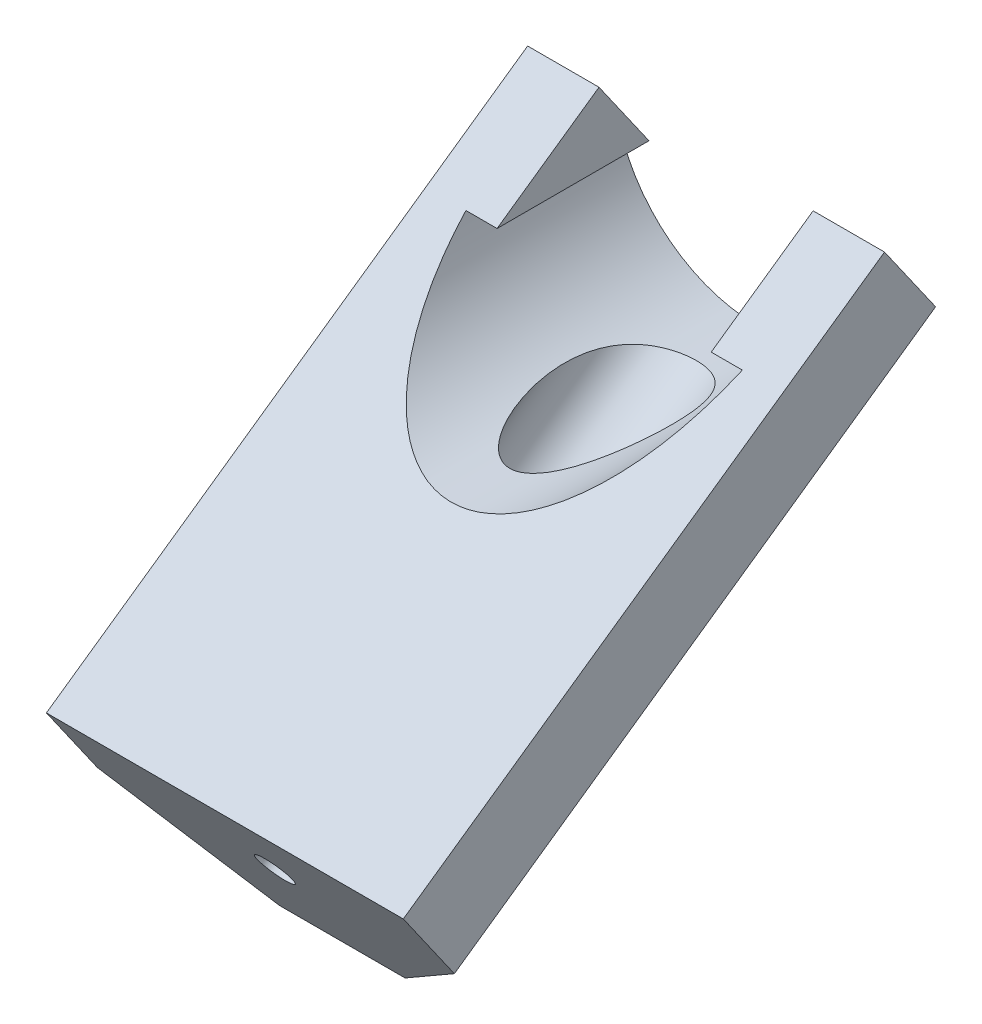
ISO-10303-21;
HEADER;
FILE_DESCRIPTION(('STEP AP214'),'2;1');
FILE_NAME('part.step','',(''),(''),'','','');
FILE_SCHEMA(('AUTOMOTIVE_DESIGN { 1 0 10303 214 1 1 1 1 }'));
ENDSEC;
DATA;
#1=APPLICATION_CONTEXT('core data for automotive mechanical design processes');
#2=APPLICATION_PROTOCOL_DEFINITION('international standard','automotive_design',2000,#1);
#3=PRODUCT_CONTEXT('',#1,'mechanical');
#4=PRODUCT('Part','Part','',(#3));
#5=PRODUCT_RELATED_PRODUCT_CATEGORY('part','',(#4));
#6=PRODUCT_DEFINITION_FORMATION('','',#4);
#7=PRODUCT_DEFINITION_CONTEXT('part definition',#1,'design');
#8=PRODUCT_DEFINITION('design','',#6,#7);
#9=PRODUCT_DEFINITION_SHAPE('','',#8);
#10=(LENGTH_UNIT() NAMED_UNIT(*) SI_UNIT(.MILLI.,.METRE.));
#11=(NAMED_UNIT(*) PLANE_ANGLE_UNIT() SI_UNIT($,.RADIAN.));
#12=(NAMED_UNIT(*) SI_UNIT($,.STERADIAN.) SOLID_ANGLE_UNIT());
#13=UNCERTAINTY_MEASURE_WITH_UNIT(LENGTH_MEASURE(1.E-05),#10,'distance_accuracy_value','');
#14=(GEOMETRIC_REPRESENTATION_CONTEXT(3) GLOBAL_UNCERTAINTY_ASSIGNED_CONTEXT((#13)) GLOBAL_UNIT_ASSIGNED_CONTEXT((#10,
#11,#12)) REPRESENTATION_CONTEXT('',''));
#15=CARTESIAN_POINT('',(0.,0.,0.));
#16=DIRECTION('',(0.,0.,1.));
#17=DIRECTION('',(1.,0.,0.));
#18=AXIS2_PLACEMENT_3D('',#15,#16,#17);
#19=CARTESIAN_POINT('',(0.,-59.9360282898142,78.6102637160665));
#20=DIRECTION('',(0.,0.573576436351043,-0.819152044288994));
#21=DIRECTION('',(0.,0.819152044288994,0.573576436351043));
#22=AXIS2_PLACEMENT_3D('',#19,#20,#21);
#23=CYLINDRICAL_SURFACE('',#22,2.5);
#24=CARTESIAN_POINT('',(0.,-52.2072930905312,67.5724859465728));
#25=DIRECTION('',(0.,-0.573576436351044,0.819152044288993));
#26=DIRECTION('',(0.,-0.819152044288993,-0.573576436351044));
#27=AXIS2_PLACEMENT_3D('',#24,#25,#26);
#28=CIRCLE('',#27,2.5);
#29=CARTESIAN_POINT('',(0.,-54.2551732012537,66.1385448556952));
#30=VERTEX_POINT('',#29);
#31=EDGE_CURVE('E154',#30,#30,#28,.T.);
#32=ORIENTED_EDGE('',*,*,#31,.T.);
#33=EDGE_LOOP('',(#32));
#34=FACE_BOUND('',#33,.T.);
#35=CARTESIAN_POINT('',(0.,-27.9430574540417,32.9195661871991));
#36=DIRECTION('',(0.,0.573576436351043,-0.819152044288994));
#37=DIRECTION('',(0.,0.819152044288994,0.573576436351043));
#38=AXIS2_PLACEMENT_3D('',#35,#36,#37);
#39=CIRCLE('',#38,2.5);
#40=CARTESIAN_POINT('',(0.,-25.8951773433193,34.3535072780767));
#41=VERTEX_POINT('',#40);
#42=EDGE_CURVE('E239',#41,#41,#39,.F.);
#43=ORIENTED_EDGE('',*,*,#42,.F.);
#44=EDGE_LOOP('',(#43));
#45=FACE_BOUND('',#44,.T.);
#46=ADVANCED_FACE('F45',(#34,#45),#23,.F.);
#47=CARTESIAN_POINT('',(0.,0.,0.));
#48=DIRECTION('',(0.,0.,1.));
#49=DIRECTION('',(1.,0.,0.));
#50=AXIS2_PLACEMENT_3D('',#47,#48,#49);
#51=PLANE('',#50);
#52=DIRECTION('',(0.633687274224643,0.773589321594955,0.));
#53=VECTOR('',#52,1.);
#54=CARTESIAN_POINT('',(17.5195335960957,-14.3511617602315,0.));
#55=LINE('',#54,#53);
#56=CARTESIAN_POINT('',(8.79651598268646,-25.,0.));
#57=VERTEX_POINT('',#56);
#58=CARTESIAN_POINT('',(25.,-5.21919846226129,0.));
#59=VERTEX_POINT('',#58);
#60=EDGE_CURVE('E161',#57,#59,#55,.T.);
#61=ORIENTED_EDGE('',*,*,#60,.F.);
#62=DIRECTION('',(1.,0.,0.));
#63=VECTOR('',#62,1.);
#64=CARTESIAN_POINT('',(-25.,-25.,0.));
#65=LINE('',#64,#63);
#66=CARTESIAN_POINT('',(-8.79651598268659,-25.,0.));
#67=VERTEX_POINT('',#66);
#68=EDGE_CURVE('E152',#67,#57,#65,.T.);
#69=ORIENTED_EDGE('',*,*,#68,.F.);
#70=DIRECTION('',(0.63368727422464,-0.773589321594957,0.));
#71=VECTOR('',#70,1.);
#72=CARTESIAN_POINT('',(-17.5195335960958,-14.3511617602314,0.));
#73=LINE('',#72,#71);
#74=CARTESIAN_POINT('',(-25.,-5.2191984622613,0.));
#75=VERTEX_POINT('',#74);
#76=EDGE_CURVE('E235',#75,#67,#73,.T.);
#77=ORIENTED_EDGE('',*,*,#76,.F.);
#78=DIRECTION('',(1.,0.,0.));
#79=VECTOR('',#78,1.);
#80=CARTESIAN_POINT('',(-25.,-5.2191984622613,0.));
#81=LINE('',#80,#79);
#82=CARTESIAN_POINT('',(-19.3069927076054,-5.2191984622613,0.));
#83=VERTEX_POINT('',#82);
#84=EDGE_CURVE('E200',#75,#83,#81,.T.);
#85=ORIENTED_EDGE('',*,*,#84,.T.);
#86=CARTESIAN_POINT('',(0.,0.,0.));
#87=DIRECTION('',(0.,0.,-1.));
#88=DIRECTION('',(1.,0.,0.));
#89=AXIS2_PLACEMENT_3D('',#86,#87,#88);
#90=CIRCLE('',#89,20.);
#91=CARTESIAN_POINT('',(19.3069927076054,-5.21919846226129,0.));
#92=VERTEX_POINT('',#91);
#93=EDGE_CURVE('E221',#92,#83,#90,.T.);
#94=ORIENTED_EDGE('',*,*,#93,.F.);
#95=DIRECTION('',(1.,0.,0.));
#96=VECTOR('',#95,1.);
#97=CARTESIAN_POINT('',(0.,-5.21919846226129,0.));
#98=LINE('',#97,#96);
#99=EDGE_CURVE('E232',#92,#59,#98,.T.);
#100=ORIENTED_EDGE('',*,*,#99,.T.);
#101=EDGE_LOOP('',(#61,#69,#77,#85,#94,#100));
#102=FACE_BOUND('',#101,.T.);
#103=ADVANCED_FACE('F269',(#102),#51,.F.);
#104=CARTESIAN_POINT('',(25.,-25.,50.));
#105=DIRECTION('',(-1.,0.,0.));
#106=DIRECTION('',(0.,-1.,0.));
#107=AXIS2_PLACEMENT_3D('',#104,#105,#106);
#108=PLANE('',#107);
#109=DIRECTION('',(0.,-0.819152044288993,-0.573576436351044));
#110=VECTOR('',#109,1.);
#111=CARTESIAN_POINT('',(25.,-42.2072930905313,74.5745613286698));
#112=LINE('',#111,#110);
#113=CARTESIAN_POINT('',(25.,-42.2072930905313,74.5745613286698));
#114=VERTEX_POINT('',#113);
#115=CARTESIAN_POINT('',(25.,-52.4264915527925,67.4190015309335));
#116=VERTEX_POINT('',#115);
#117=EDGE_CURVE('E164',#114,#116,#112,.T.);
#118=ORIENTED_EDGE('',*,*,#117,.T.);
#119=DIRECTION('',(0.,-0.573576436351043,0.819152044288994));
#120=VECTOR('',#119,1.);
#121=CARTESIAN_POINT('',(25.,-35.2191984622612,42.8444402022637));
#122=LINE('',#121,#120);
#123=EDGE_CURVE('E67',#59,#116,#122,.T.);
#124=ORIENTED_EDGE('',*,*,#123,.F.);
#125=DIRECTION('',(0.,-0.819152044288994,-0.573576436351043));
#126=VECTOR('',#125,1.);
#127=CARTESIAN_POINT('',(25.,5.,7.15555979773638));
#128=LINE('',#127,#126);
#129=CARTESIAN_POINT('',(25.,5.,7.15555979773638));
#130=VERTEX_POINT('',#129);
#131=EDGE_CURVE('E191',#130,#59,#128,.T.);
#132=ORIENTED_EDGE('',*,*,#131,.F.);
#133=DIRECTION('',(0.,0.573576436351044,-0.819152044288993));
#134=VECTOR('',#133,1.);
#135=CARTESIAN_POINT('',(25.,-25.,50.));
#136=LINE('',#135,#134);
#137=EDGE_CURVE('E172',#114,#130,#136,.T.);
#138=ORIENTED_EDGE('',*,*,#137,.F.);
#139=EDGE_LOOP('',(#118,#124,#132,#138));
#140=FACE_BOUND('',#139,.T.);
#141=ADVANCED_FACE('F251',(#140),#108,.F.);
#142=CARTESIAN_POINT('',(-25.,5.,50.));
#143=DIRECTION('',(1.,0.,0.));
#144=DIRECTION('',(0.,0.,-1.));
#145=AXIS2_PLACEMENT_3D('',#142,#143,#144);
#146=PLANE('',#145);
#147=DIRECTION('',(0.,0.573576436351043,-0.819152044288994));
#148=VECTOR('',#147,1.);
#149=CARTESIAN_POINT('',(-25.,-35.2191984622612,42.8444402022637));
#150=LINE('',#149,#148);
#151=CARTESIAN_POINT('',(-25.,-52.4264915527925,67.4190015309335));
#152=VERTEX_POINT('',#151);
#153=EDGE_CURVE('E169',#152,#75,#150,.T.);
#154=ORIENTED_EDGE('',*,*,#153,.F.);
#155=DIRECTION('',(0.,0.819152044288993,0.573576436351044));
#156=VECTOR('',#155,1.);
#157=CARTESIAN_POINT('',(-25.,-42.2072930905313,74.5745613286698));
#158=LINE('',#157,#156);
#159=CARTESIAN_POINT('',(-25.,-42.2072930905313,74.5745613286698));
#160=VERTEX_POINT('',#159);
#161=EDGE_CURVE('E158',#152,#160,#158,.T.);
#162=ORIENTED_EDGE('',*,*,#161,.T.);
#163=DIRECTION('',(0.,0.573576436351044,-0.819152044288993));
#164=VECTOR('',#163,1.);
#165=CARTESIAN_POINT('',(-25.,-25.,50.));
#166=LINE('',#165,#164);
#167=CARTESIAN_POINT('',(-25.,4.99999999999999,7.15555979773638));
#168=VERTEX_POINT('',#167);
#169=EDGE_CURVE('E171',#160,#168,#166,.T.);
#170=ORIENTED_EDGE('',*,*,#169,.T.);
#171=DIRECTION('',(0.,-0.819152044288994,-0.573576436351043));
#172=VECTOR('',#171,1.);
#173=CARTESIAN_POINT('',(-25.,4.99999999999999,7.15555979773638));
#174=LINE('',#173,#172);
#175=EDGE_CURVE('E197',#168,#75,#174,.T.);
#176=ORIENTED_EDGE('',*,*,#175,.T.);
#177=EDGE_LOOP('',(#154,#162,#170,#176));
#178=FACE_BOUND('',#177,.T.);
#179=ADVANCED_FACE('F260',(#178),#146,.F.);
#180=CARTESIAN_POINT('',(-15.,0.,50.));
#181=DIRECTION('',(-1.,0.,0.));
#182=DIRECTION('',(0.,0.,1.));
#183=AXIS2_PLACEMENT_3D('',#180,#181,#182);
#184=PLANE('',#183);
#185=DIRECTION('',(0.,0.819152044288994,0.573576436351043));
#186=VECTOR('',#185,1.);
#187=CARTESIAN_POINT('',(-15.,21.7752517915709,18.9017175575602));
#188=LINE('',#187,#186);
#189=CARTESIAN_POINT('',(-15.,-5.,0.153484415639338));
#190=VERTEX_POINT('',#189);
#191=CARTESIAN_POINT('',(-15.,4.99999999999999,7.15555979773638));
#192=VERTEX_POINT('',#191);
#193=EDGE_CURVE('E210',#190,#192,#188,.T.);
#194=ORIENTED_EDGE('',*,*,#193,.T.);
#195=DIRECTION('',(0.,-0.573576436351044,0.819152044288993));
#196=VECTOR('',#195,1.);
#197=CARTESIAN_POINT('',(-15.,-16.7752517915709,38.2538422401762));
#198=LINE('',#197,#196);
#199=CARTESIAN_POINT('',(-15.,-5.,21.4370398651576));
#200=VERTEX_POINT('',#199);
#201=EDGE_CURVE('E188',#192,#200,#198,.T.);
#202=ORIENTED_EDGE('',*,*,#201,.T.);
#203=DIRECTION('',(0.,0.,-1.));
#204=VECTOR('',#203,1.);
#205=CARTESIAN_POINT('',(-15.,-5.,50.));
#206=LINE('',#205,#204);
#207=EDGE_CURVE('E224',#200,#190,#206,.T.);
#208=ORIENTED_EDGE('',*,*,#207,.T.);
#209=EDGE_LOOP('',(#194,#202,#208));
#210=FACE_BOUND('',#209,.T.);
#211=ADVANCED_FACE('F47',(#210),#184,.F.);
#212=CARTESIAN_POINT('',(15.,5.,50.));
#213=DIRECTION('',(1.,0.,0.));
#214=DIRECTION('',(0.,0.,-1.));
#215=AXIS2_PLACEMENT_3D('',#212,#213,#214);
#216=PLANE('',#215);
#217=DIRECTION('',(0.,0.,-1.));
#218=VECTOR('',#217,1.);
#219=CARTESIAN_POINT('',(15.,-5.,50.));
#220=LINE('',#219,#218);
#221=CARTESIAN_POINT('',(15.,-5.,21.4370398651576));
#222=VERTEX_POINT('',#221);
#223=CARTESIAN_POINT('',(15.,-5.,0.153484415639338));
#224=VERTEX_POINT('',#223);
#225=EDGE_CURVE('E230',#222,#224,#220,.T.);
#226=ORIENTED_EDGE('',*,*,#225,.F.);
#227=DIRECTION('',(0.,0.573576436351044,-0.819152044288993));
#228=VECTOR('',#227,1.);
#229=CARTESIAN_POINT('',(15.,-15.1303021498851,35.9046106882114));
#230=LINE('',#229,#228);
#231=CARTESIAN_POINT('',(15.,5.,7.15555979773638));
#232=VERTEX_POINT('',#231);
#233=EDGE_CURVE('E185',#222,#232,#230,.T.);
#234=ORIENTED_EDGE('',*,*,#233,.T.);
#235=DIRECTION('',(0.,-0.819152044288994,-0.573576436351043));
#236=VECTOR('',#235,1.);
#237=CARTESIAN_POINT('',(15.,25.1303021498851,21.2509491095249));
#238=LINE('',#237,#236);
#239=EDGE_CURVE('E217',#232,#224,#238,.T.);
#240=ORIENTED_EDGE('',*,*,#239,.T.);
#241=EDGE_LOOP('',(#226,#234,#240));
#242=FACE_BOUND('',#241,.T.);
#243=ADVANCED_FACE('F284',(#242),#216,.F.);
#244=CARTESIAN_POINT('',(15.,-5.,50.));
#245=DIRECTION('',(0.,1.,0.));
#246=DIRECTION('',(-1.,0.,0.));
#247=AXIS2_PLACEMENT_3D('',#244,#245,#246);
#248=PLANE('',#247);
#249=DIRECTION('',(0.,0.,-1.));
#250=VECTOR('',#249,1.);
#251=CARTESIAN_POINT('',(19.3649167310371,-5.,50.));
#252=LINE('',#251,#250);
#253=CARTESIAN_POINT('',(19.3649167310371,-5.,21.4370398651576));
#254=VERTEX_POINT('',#253);
#255=CARTESIAN_POINT('',(19.3649167310371,-5.,0.153484415639331));
#256=VERTEX_POINT('',#255);
#257=EDGE_CURVE('E228',#254,#256,#252,.T.);
#258=ORIENTED_EDGE('',*,*,#257,.F.);
#259=DIRECTION('',(-1.,0.,0.));
#260=VECTOR('',#259,1.);
#261=CARTESIAN_POINT('',(15.,-5.,21.4370398651576));
#262=LINE('',#261,#260);
#263=EDGE_CURVE('E182',#254,#222,#262,.T.);
#264=ORIENTED_EDGE('',*,*,#263,.T.);
#265=ORIENTED_EDGE('',*,*,#225,.T.);
#266=DIRECTION('',(1.,0.,0.));
#267=VECTOR('',#266,1.);
#268=CARTESIAN_POINT('',(15.,-5.,0.153484415639338));
#269=LINE('',#268,#267);
#270=EDGE_CURVE('E214',#224,#256,#269,.T.);
#271=ORIENTED_EDGE('',*,*,#270,.T.);
#272=EDGE_LOOP('',(#258,#264,#265,#271));
#273=FACE_BOUND('',#272,.T.);
#274=ADVANCED_FACE('F281',(#273),#248,.F.);
#275=CARTESIAN_POINT('',(0.,0.,50.));
#276=DIRECTION('',(0.,0.,-1.));
#277=DIRECTION('',(-1.,0.,0.));
#278=AXIS2_PLACEMENT_3D('',#275,#276,#277);
#279=CYLINDRICAL_SURFACE('',#278,20.);
#280=CARTESIAN_POINT('',(0.,-20.,34.6515554839295));
#281=CARTESIAN_POINT('',(-0.100165764700678,-20.0000000597689,34.6515557997019));
#282=CARTESIAN_POINT('',(-0.200325338023435,-19.9992448655115,34.6469676792457));
#283=CARTESIAN_POINT('',(-0.399812118135924,-19.9962528192261,34.6287739854373));
#284=CARTESIAN_POINT('',(-0.499139034498164,-19.9940154703606,34.6151653883031));
#285=CARTESIAN_POINT('',(-0.794733442385864,-19.9851723247315,34.5613122672029));
#286=CARTESIAN_POINT('',(-0.988662979251484,-19.9764353788738,34.5080401399757));
#287=CARTESIAN_POINT('',(-1.41267484977992,-19.9514484907195,34.3549278729471));
#288=CARTESIAN_POINT('',(-1.63958791087269,-19.9338619041286,34.2467469995581));
#289=CARTESIAN_POINT('',(-2.07307299720692,-19.8934672806585,33.9960583434451));
#290=CARTESIAN_POINT('',(-2.27960034925754,-19.8706481252555,33.8534774309989));
#291=CARTESIAN_POINT('',(-2.63840051257692,-19.8258814807791,33.5707519662403));
#292=CARTESIAN_POINT('',(-2.79386758375854,-19.8044704600178,33.4344820152478));
#293=CARTESIAN_POINT('',(-3.09234950644016,-19.7600647755974,33.1490535356371));
#294=CARTESIAN_POINT('',(-3.23535553969485,-19.7370690107513,32.9998860262191));
#295=CARTESIAN_POINT('',(-3.51024500023595,-19.6900393461474,32.69142901312));
#296=CARTESIAN_POINT('',(-3.64210970912294,-19.6660037980014,32.5321232335551));
#297=CARTESIAN_POINT('',(-3.89569135456386,-19.6173457935971,32.2056633342165));
#298=CARTESIAN_POINT('',(-4.01740431640183,-19.5927231122651,32.0385061800599));
#299=CARTESIAN_POINT('',(-4.25303712718851,-19.5429358216568,31.6959615647145));
#300=CARTESIAN_POINT('',(-4.36684895195968,-19.51776824302,31.5205006166777));
#301=CARTESIAN_POINT('',(-4.58599198065271,-19.4674422763529,31.1644131904983));
#302=CARTESIAN_POINT('',(-4.69132423305366,-19.4422838875705,30.9837873547364));
#303=CARTESIAN_POINT('',(-4.89438151793121,-19.3921627450927,30.6180819798716));
#304=CARTESIAN_POINT('',(-4.99209967385884,-19.3672001861405,30.4329986080202));
#305=CARTESIAN_POINT('',(-5.18046234982847,-19.3176674221665,30.0592055254517));
#306=CARTESIAN_POINT('',(-5.27110602907865,-19.2930972640561,29.8704953870097));
#307=CARTESIAN_POINT('',(-5.53376090380535,-19.220060278464,29.2986095568156));
#308=CARTESIAN_POINT('',(-5.69590157620915,-19.1724171566986,28.9107675283725));
#309=CARTESIAN_POINT('',(-5.99697511777804,-19.0803818870148,28.1260469844145));
#310=CARTESIAN_POINT('',(-6.13591493595012,-19.0359887679168,27.7291712152564));
#311=CARTESIAN_POINT('',(-6.37216519518103,-18.9580688279611,26.9922404750034));
#312=CARTESIAN_POINT('',(-6.47258013283359,-18.9239390834188,26.6532377787157));
#313=CARTESIAN_POINT('',(-6.65926432812565,-18.8590552535482,25.9710057326786));
#314=CARTESIAN_POINT('',(-6.74553203850851,-18.8283015375715,25.6277759250251));
#315=CARTESIAN_POINT('',(-6.90438966540064,-18.7706297965948,24.9375626266501));
#316=CARTESIAN_POINT('',(-6.9769686790644,-18.7437148332292,24.5905763746084));
#317=CARTESIAN_POINT('',(-7.1084790205062,-18.6942360068709,23.8937344217343));
#318=CARTESIAN_POINT('',(-7.16741095991144,-18.6716719488891,23.5438788502253));
#319=CARTESIAN_POINT('',(-7.27134258408542,-18.6314431504861,22.8426984482171));
#320=CARTESIAN_POINT('',(-7.31637604596065,-18.6137665432932,22.4913793166688));
#321=CARTESIAN_POINT('',(-7.39227546453637,-18.5837544863007,21.7869566922631));
#322=CARTESIAN_POINT('',(-7.42314059298116,-18.5714193487564,21.4338530963086));
#323=CARTESIAN_POINT('',(-7.46996519739738,-18.5526348467354,20.7268096587037));
#324=CARTESIAN_POINT('',(-7.48593812931007,-18.5461801690517,20.3728708622223));
#325=CARTESIAN_POINT('',(-7.50201500691995,-18.5396831860365,19.6646179692345));
#326=CARTESIAN_POINT('',(-7.50212181444873,-18.5396397242904,19.3103039519376));
#327=CARTESIAN_POINT('',(-7.4850826512335,-18.5465261931417,18.5997603953597));
#328=CARTESIAN_POINT('',(-7.46782137827953,-18.5535027276982,18.2435338787207));
#329=CARTESIAN_POINT('',(-7.41414729392074,-18.575017421128,17.532726085382));
#330=CARTESIAN_POINT('',(-7.37773510262223,-18.5895553351638,17.1781447557862));
#331=CARTESIAN_POINT('',(-7.28368709223459,-18.6266064658704,16.4725103760778));
#332=CARTESIAN_POINT('',(-7.22607068419687,-18.6491123876459,16.1214543997368));
#333=CARTESIAN_POINT('',(-7.08710836921973,-18.7023655667995,15.4246785955902));
#334=CARTESIAN_POINT('',(-7.00576716294179,-18.7331111915242,15.0789577249982));
#335=CARTESIAN_POINT('',(-6.83571998373456,-18.7957267451926,14.4650443313902));
#336=CARTESIAN_POINT('',(-6.75186012339038,-18.826101755496,14.1953589265373));
#337=CARTESIAN_POINT('',(-6.56568744863667,-18.8918373010068,13.6629873012653));
#338=CARTESIAN_POINT('',(-6.46337429461047,-18.9271979279675,13.4003012097647));
#339=CARTESIAN_POINT('',(-6.23889046375792,-19.0023745719992,12.8845768443967));
#340=CARTESIAN_POINT('',(-6.11674595765674,-19.0421846959417,12.6315263907905));
#341=CARTESIAN_POINT('',(-5.85108883496414,-19.1254839567412,12.1375270561977));
#342=CARTESIAN_POINT('',(-5.70758331424581,-19.1689718698167,11.8965741919479));
#343=CARTESIAN_POINT('',(-5.43843566420249,-19.246754691234,11.4908086488825));
#344=CARTESIAN_POINT('',(-5.31787509586239,-19.2804940683587,11.3225096691192));
#345=CARTESIAN_POINT('',(-5.06422698758608,-19.3486653365961,10.9958016345721));
#346=CARTESIAN_POINT('',(-4.93114263597325,-19.3830970497071,10.8373900796223));
#347=CARTESIAN_POINT('',(-4.65235894722869,-19.4518935832601,10.5319779944122));
#348=CARTESIAN_POINT('',(-4.50665722182135,-19.4862583897736,10.3849796345258));
#349=CARTESIAN_POINT('',(-4.20297157932298,-19.5540075694667,10.1041423063925));
#350=CARTESIAN_POINT('',(-4.04499385123044,-19.5873924251456,9.97029678318263));
#351=CARTESIAN_POINT('',(-3.71573818711509,-19.652523991357,9.71616417248772));
#352=CARTESIAN_POINT('',(-3.54435092945714,-19.6842527334675,9.59601366184152));
#353=CARTESIAN_POINT('',(-3.19050835216445,-19.7446918435448,9.37234426164712));
#354=CARTESIAN_POINT('',(-3.00805272219323,-19.7734021268179,9.26882583872877));
#355=CARTESIAN_POINT('',(-2.63350011631246,-19.8267605191974,9.07997376848729));
#356=CARTESIAN_POINT('',(-2.44140840201916,-19.8514108143603,8.99463032774051));
#357=CARTESIAN_POINT('',(-2.04917816663851,-19.895722821693,8.84335910626924));
#358=CARTESIAN_POINT('',(-1.84904103932082,-19.9153853936473,8.77742797893174));
#359=CARTESIAN_POINT('',(-1.47123083488084,-19.9465840179694,8.67381701729646));
#360=CARTESIAN_POINT('',(-1.29434653309389,-19.958873255847,8.63347104185192));
#361=CARTESIAN_POINT('',(-0.937480589690072,-19.9788150560379,8.56833914042907));
#362=CARTESIAN_POINT('',(-0.757499221544082,-19.9864680255949,8.54355184778971));
#363=CARTESIAN_POINT('',(-0.395993347489922,-19.9968967014942,8.50983676069629));
#364=CARTESIAN_POINT('',(-0.214469515257334,-19.9996744371323,8.50090236752224));
#365=CARTESIAN_POINT('',(0.148669650441556,-20.0002714425591,8.49897905661451));
#366=CARTESIAN_POINT('',(0.330284980558239,-19.9980908823038,8.50598959233475));
#367=CARTESIAN_POINT('',(0.678312261583499,-19.9891935780328,8.53473227271456));
#368=CARTESIAN_POINT('',(0.84483051627535,-19.9828342349714,8.55530490037985));
#369=CARTESIAN_POINT('',(1.17546660109532,-19.966113179921,8.60977893066209));
#370=CARTESIAN_POINT('',(1.33958446331329,-19.9557515214881,8.64368015492535));
#371=CARTESIAN_POINT('',(1.66427234046379,-19.9312995643176,8.72446433090999));
#372=CARTESIAN_POINT('',(1.82484298007153,-19.9172099278503,8.7713449769229));
#373=CARTESIAN_POINT('',(2.14144261121374,-19.8856615591259,8.8776277721444));
#374=CARTESIAN_POINT('',(2.29747147229872,-19.8682027302081,8.93703028060423));
#375=CARTESIAN_POINT('',(2.60622680527883,-19.8300812130389,9.06870325218695));
#376=CARTESIAN_POINT('',(2.75887568779681,-19.8093768193922,9.14114335178332));
#377=CARTESIAN_POINT('',(3.05777770044391,-19.7654452695104,9.29763205098645));
#378=CARTESIAN_POINT('',(3.20402866557001,-19.742217268429,9.38168454073056));
#379=CARTESIAN_POINT('',(3.48937884283358,-19.6937852678654,9.56057871909949));
#380=CARTESIAN_POINT('',(3.62847948162119,-19.6685816651136,9.65541824324259));
#381=CARTESIAN_POINT('',(3.89908880548796,-19.6167300390073,9.85508965375622));
#382=CARTESIAN_POINT('',(4.03059469362114,-19.5900814904345,9.95992518418532));
#383=CARTESIAN_POINT('',(4.29749358294597,-19.5333525923879,10.1888947666673));
#384=CARTESIAN_POINT('',(4.43210665458226,-19.5031838685641,10.3139168153357));
#385=CARTESIAN_POINT('',(4.69152208770776,-19.4424114994624,10.5736883068975));
#386=CARTESIAN_POINT('',(4.81632053603773,-19.4118076863961,10.7084415890378));
#387=CARTESIAN_POINT('',(5.17583582399306,-19.3202494112841,11.1256419353703));
#388=CARTESIAN_POINT('',(5.39574770012316,-19.2595315249675,11.4210949805986));
#389=CARTESIAN_POINT('',(5.75250868344418,-19.1555503739354,11.9696368633126));
#390=CARTESIAN_POINT('',(5.89698536563053,-19.1113875250252,12.2177299463353));
#391=CARTESIAN_POINT('',(6.1638018764006,-19.0270105943897,12.7263239085639));
#392=CARTESIAN_POINT('',(6.28613160249138,-18.9867983185526,12.9868303821274));
#393=CARTESIAN_POINT('',(6.5102782940187,-18.9111157906386,13.5176484888224));
#394=CARTESIAN_POINT('',(6.61205933586822,-18.8756538790256,13.7879763351426));
#395=CARTESIAN_POINT('',(6.79653461686461,-18.8100145934084,14.335621388634));
#396=CARTESIAN_POINT('',(6.87922908824457,-18.7798371551073,14.6129385107185));
#397=CARTESIAN_POINT('',(7.06835038400509,-18.7097229844804,15.3283005223483));
#398=CARTESIAN_POINT('',(7.1624225420524,-18.673684139542,15.7700116034476));
#399=CARTESIAN_POINT('',(7.31411768459772,-18.6147830178629,16.6605352361125));
#400=CARTESIAN_POINT('',(7.3717190999985,-18.5919285391737,17.1093518294259));
#401=CARTESIAN_POINT('',(7.45524767682238,-18.5585903803724,18.0118210737661));
#402=CARTESIAN_POINT('',(7.48106679434256,-18.5481489023436,18.4654849615311));
#403=CARTESIAN_POINT('',(7.50437209263279,-18.5387304674325,19.373533541417));
#404=CARTESIAN_POINT('',(7.50186170730063,-18.5397521210721,19.8279181395028));
#405=CARTESIAN_POINT('',(7.47472681048486,-18.5507027180488,20.6323165717818));
#406=CARTESIAN_POINT('',(7.45526436857544,-18.5585519013963,20.9825523263521));
#407=CARTESIAN_POINT('',(7.40195763890025,-18.5798777130724,21.681791809312));
#408=CARTESIAN_POINT('',(7.36811180837377,-18.5933549450621,22.03079540149));
#409=CARTESIAN_POINT('',(7.28663761716191,-18.6254349233543,22.7272058057947));
#410=CARTESIAN_POINT('',(7.23899903798047,-18.6440414692694,23.0746112393459));
#411=CARTESIAN_POINT('',(7.13031150608641,-18.6858783604251,23.7670190101817));
#412=CARTESIAN_POINT('',(7.06926314457091,-18.709108501821,24.1120214527155));
#413=CARTESIAN_POINT('',(6.9341192827218,-18.7596155311775,24.7977540263307));
#414=CARTESIAN_POINT('',(6.8600757123215,-18.7868762467459,25.1384955856579));
#415=CARTESIAN_POINT('',(6.69860865591938,-18.8450527259545,25.8165075791642));
#416=CARTESIAN_POINT('',(6.61118430874695,-18.8759687248152,26.1537777884394));
#417=CARTESIAN_POINT('',(6.4225941267284,-18.9409668953084,26.8238099485279));
#418=CARTESIAN_POINT('',(6.3214411629292,-18.9750460919861,27.1565758047402));
#419=CARTESIAN_POINT('',(6.10457031443251,-19.0459249473798,27.8169927979629));
#420=CARTESIAN_POINT('',(5.98885524409778,-19.0827240798585,28.1446449095704));
#421=CARTESIAN_POINT('',(5.78253186623547,-19.1460124169681,28.6863896522145));
#422=CARTESIAN_POINT('',(5.69626996434141,-19.1718882183297,28.9022149363771));
#423=CARTESIAN_POINT('',(5.51620499715689,-19.2244710523908,29.3305837272695));
#424=CARTESIAN_POINT('',(5.42240258514405,-19.2511780129598,29.5431275163961));
#425=CARTESIAN_POINT('',(5.22631745492145,-19.3053358552305,29.9650916637485));
#426=CARTESIAN_POINT('',(5.12400648610964,-19.3327889934379,30.1744986518082));
#427=CARTESIAN_POINT('',(4.91044318681856,-19.3881332549959,30.5886384268428));
#428=CARTESIAN_POINT('',(4.79919136982558,-19.4160243531199,30.7933714813828));
#429=CARTESIAN_POINT('',(4.53799863575112,-19.4789339685873,31.2472464381871));
#430=CARTESIAN_POINT('',(4.3853043637564,-19.5140050337128,31.4948129164469));
#431=CARTESIAN_POINT('',(4.06215022447054,-19.5838275292305,31.9785060183651));
#432=CARTESIAN_POINT('',(3.89167717479024,-19.6185787013557,32.2146239605338));
#433=CARTESIAN_POINT('',(3.53124662072565,-19.6866398183188,32.669626170757));
#434=CARTESIAN_POINT('',(3.34140868526961,-19.7199569930573,32.8886030073539));
#435=CARTESIAN_POINT('',(2.93836490506706,-19.7840231077053,33.3040042432825));
#436=CARTESIAN_POINT('',(2.72520749799635,-19.8147771458551,33.5004737177577));
#437=CARTESIAN_POINT('',(2.32113841389196,-19.8656568188417,33.8220584907027));
#438=CARTESIAN_POINT('',(2.13535535201467,-19.8866437607639,33.953422010257));
#439=CARTESIAN_POINT('',(1.74654827989981,-19.9245459270375,34.1891207265174));
#440=CARTESIAN_POINT('',(1.54353207932058,-19.9414629825805,34.2934680804069));
#441=CARTESIAN_POINT('',(1.2274955413545,-19.9625769354557,34.4231517633241));
#442=CARTESIAN_POINT('',(1.12006346521942,-19.9689108604229,34.461944265234));
#443=CARTESIAN_POINT('',(0.902011971537765,-19.979946582012,34.5294185716481));
#444=CARTESIAN_POINT('',(0.79139446855129,-19.9846493377334,34.5581063177299));
#445=CARTESIAN_POINT('',(0.567933157608927,-19.9922468452581,34.6044045562616));
#446=CARTESIAN_POINT('',(0.455092285225387,-19.9951438352524,34.6220287618226));
#447=CARTESIAN_POINT('',(0.22816480634828,-19.9990202358872,34.6456031770942));
#448=CARTESIAN_POINT('',(0.11407838780528,-19.9999999319295,34.6515551242976));
#449=CARTESIAN_POINT('',(0.,-20.,34.6515554839295));
#450=B_SPLINE_CURVE_WITH_KNOTS('',3,(#280,#281,#282,#283,#284,#285,#286,#287,#288,#289,#290,
#291,#292,#293,#294,#295,#296,#297,#298,#299,#300,#301,#302,#303,#304,#305,#306,#307,#308,#309,
#310,#311,#312,#313,#314,#315,#316,#317,#318,#319,#320,#321,#322,#323,#324,#325,#326,#327,#328,
#329,#330,#331,#332,#333,#334,#335,#336,#337,#338,#339,#340,#341,#342,#343,#344,#345,#346,#347,
#348,#349,#350,#351,#352,#353,#354,#355,#356,#357,#358,#359,#360,#361,#362,#363,#364,#365,#366,
#367,#368,#369,#370,#371,#372,#373,#374,#375,#376,#377,#378,#379,#380,#381,#382,#383,#384,#385,
#386,#387,#388,#389,#390,#391,#392,#393,#394,#395,#396,#397,#398,#399,#400,#401,#402,#403,#404,
#405,#406,#407,#408,#409,#410,#411,#412,#413,#414,#415,#416,#417,#418,#419,#420,#421,#422,#423,
#424,#425,#426,#427,#428,#429,#430,#431,#432,#433,#434,#435,#436,#437,#438,#439,#440,#441,#442,
#443,#444,#445,#446,#447,#448,#449),.UNSPECIFIED.,.T.,.F.,(4,2,2,2,2,2,2,2,2,2,2,2,2,2,2,2,2,2,
2,2,2,2,2,2,2,2,2,2,2,2,2,2,2,2,2,2,2,2,2,2,2,2,2,2,2,2,2,2,2,2,2,2,2,2,2,2,2,2,2,2,2,2,2,2,2,2,
2,2,2,2,2,2,2,2,2,2,2,2,2,2,2,2,2,2,4),(0.,0.300372269192642,0.600845278065372,1.20164828977866,
1.95350648392912,2.70697733052682,3.32963606266121,3.95273190969345,4.57685461621582,
5.20122054964675,5.83290232733583,6.46450587871458,7.09667339571132,7.72891593089861,
8.9971417351154,10.2649870025189,11.3302740096634,12.3956774477325,13.4619259131158,
14.5281265826992,15.5917153090254,16.6553662029516,17.7180550941246,18.780552303935,
19.8501500054023,20.9197130754512,21.9882994572217,23.0566742606029,23.9081934431565,
24.7597282987715,25.610148414184,26.46028665808,27.0890138875845,27.717581485576,
28.3462683229434,28.9746402363041,29.6088131901784,30.2430039333035,30.8768520790028,
31.510590887494,32.055398006316,32.6001572630589,33.1446897122176,33.6892034966583,
34.192327960994,34.6954456931094,35.1984741069689,35.7015169546391,36.2116530716487,
36.7219604999356,37.2321657120898,37.742557636642,38.3005160293472,38.8586957678788,
39.9747550137406,40.8450781867235,41.7157973690327,42.5880258229751,43.460243663644,
44.8172358052681,46.1750297354278,47.5374268504292,48.8996588272637,49.9519140438435,
51.0042821537013,52.0574319248221,53.1105352750407,54.1595223688484,55.2085770026083,
56.2566548196917,57.3045303889618,58.0059891924814,58.7073872899638,59.411215064879,
60.1150024467584,60.993291111448,61.8722356922162,62.7460486434508,63.6180798447066,
64.3018944621418,64.985400828365,65.3281718748251,65.6707410347693,66.012884742034,
66.3549775150818),.UNSPECIFIED.);
#451=CARTESIAN_POINT('',(0.,-20.,34.6515554839295));
#452=VERTEX_POINT('',#451);
#453=EDGE_CURVE('E49',#452,#452,#450,.T.);
#454=ORIENTED_EDGE('',*,*,#453,.T.);
#455=EDGE_LOOP('',(#454));
#456=FACE_BOUND('',#455,.T.);
#457=DIRECTION('',(0.,0.,-1.));
#458=VECTOR('',#457,1.);
#459=CARTESIAN_POINT('',(-19.3649167310371,-4.99999999999999,50.));
#460=LINE('',#459,#458);
#461=CARTESIAN_POINT('',(-19.3649167310371,-5.,21.4370398651576));
#462=VERTEX_POINT('',#461);
#463=CARTESIAN_POINT('',(-19.3649167310371,-5.,0.153484415639338));
#464=VERTEX_POINT('',#463);
#465=EDGE_CURVE('E226',#462,#464,#460,.T.);
#466=ORIENTED_EDGE('',*,*,#465,.F.);
#467=CARTESIAN_POINT('',(0.,0.,14.296299831447));
#468=DIRECTION('',(0.,-0.819152044288993,-0.573576436351044));
#469=DIRECTION('',(0.,0.573576436351044,-0.819152044288993));
#470=AXIS2_PLACEMENT_3D('',#467,#468,#469);
#471=ELLIPSE('',#470,34.8689359124221,20.);
#472=EDGE_CURVE('E179',#462,#254,#471,.F.);
#473=ORIENTED_EDGE('',*,*,#472,.T.);
#474=ORIENTED_EDGE('',*,*,#257,.T.);
#475=CARTESIAN_POINT('',(0.,0.,3.65452210668785));
#476=DIRECTION('',(0.,-0.573576436351043,0.819152044288994));
#477=DIRECTION('',(0.,-0.819152044288994,-0.573576436351043));
#478=AXIS2_PLACEMENT_3D('',#475,#476,#477);
#479=ELLIPSE('',#478,24.4154917752291,20.);
#480=EDGE_CURVE('E211',#256,#92,#479,.F.);
#481=ORIENTED_EDGE('',*,*,#480,.T.);
#482=ORIENTED_EDGE('',*,*,#93,.T.);
#483=EDGE_CURVE('E207',#83,#464,#479,.F.);
#484=ORIENTED_EDGE('',*,*,#483,.T.);
#485=EDGE_LOOP('',(#466,#473,#474,#481,#482,#484));
#486=FACE_BOUND('',#485,.T.);
#487=ADVANCED_FACE('F273',(#456,#486),#279,.F.);
#488=CARTESIAN_POINT('',(-15.,-5.,50.));
#489=DIRECTION('',(0.,1.,0.));
#490=DIRECTION('',(-1.,0.,0.));
#491=AXIS2_PLACEMENT_3D('',#488,#489,#490);
#492=PLANE('',#491);
#493=ORIENTED_EDGE('',*,*,#207,.F.);
#494=DIRECTION('',(-1.,0.,0.));
#495=VECTOR('',#494,1.);
#496=CARTESIAN_POINT('',(-15.,-5.,21.4370398651576));
#497=LINE('',#496,#495);
#498=EDGE_CURVE('E174',#200,#462,#497,.T.);
#499=ORIENTED_EDGE('',*,*,#498,.T.);
#500=ORIENTED_EDGE('',*,*,#465,.T.);
#501=DIRECTION('',(1.,0.,0.));
#502=VECTOR('',#501,1.);
#503=CARTESIAN_POINT('',(-15.,-5.,0.153484415639338));
#504=LINE('',#503,#502);
#505=EDGE_CURVE('E195',#464,#190,#504,.T.);
#506=ORIENTED_EDGE('',*,*,#505,.T.);
#507=EDGE_LOOP('',(#493,#499,#500,#506));
#508=FACE_BOUND('',#507,.T.);
#509=ADVANCED_FACE('F287',(#508),#492,.F.);
#510=CARTESIAN_POINT('',(-25.,4.99999999999999,7.15555979773638));
#511=DIRECTION('',(0.,-0.573576436351043,0.819152044288994));
#512=DIRECTION('',(0.,-0.819152044288994,-0.573576436351043));
#513=AXIS2_PLACEMENT_3D('',#510,#511,#512);
#514=PLANE('',#513);
#515=DIRECTION('',(1.,0.,0.));
#516=VECTOR('',#515,1.);
#517=CARTESIAN_POINT('',(-25.,4.99999999999999,7.15555979773638));
#518=LINE('',#517,#516);
#519=EDGE_CURVE('E196',#232,#130,#518,.T.);
#520=ORIENTED_EDGE('',*,*,#519,.T.);
#521=ORIENTED_EDGE('',*,*,#131,.T.);
#522=ORIENTED_EDGE('',*,*,#99,.F.);
#523=ORIENTED_EDGE('',*,*,#480,.F.);
#524=ORIENTED_EDGE('',*,*,#270,.F.);
#525=ORIENTED_EDGE('',*,*,#239,.F.);
#526=EDGE_LOOP('',(#520,#521,#522,#523,#524,#525));
#527=FACE_BOUND('',#526,.T.);
#528=ADVANCED_FACE('F278',(#527),#514,.F.);
#529=ORIENTED_EDGE('',*,*,#505,.F.);
#530=ORIENTED_EDGE('',*,*,#483,.F.);
#531=ORIENTED_EDGE('',*,*,#84,.F.);
#532=ORIENTED_EDGE('',*,*,#175,.F.);
#533=EDGE_CURVE('E192',#168,#192,#518,.T.);
#534=ORIENTED_EDGE('',*,*,#533,.T.);
#535=ORIENTED_EDGE('',*,*,#193,.F.);
#536=EDGE_LOOP('',(#529,#530,#531,#532,#534,#535));
#537=FACE_BOUND('',#536,.T.);
#538=ADVANCED_FACE('F264',(#537),#514,.F.);
#539=CARTESIAN_POINT('',(-25.,-25.,50.));
#540=DIRECTION('',(0.,-0.819152044288993,-0.573576436351044));
#541=DIRECTION('',(0.,0.573576436351044,-0.819152044288993));
#542=AXIS2_PLACEMENT_3D('',#539,#540,#541);
#543=PLANE('',#542);
#544=ORIENTED_EDGE('',*,*,#533,.F.);
#545=ORIENTED_EDGE('',*,*,#169,.F.);
#546=DIRECTION('',(1.,0.,0.));
#547=VECTOR('',#546,1.);
#548=CARTESIAN_POINT('',(-109.957773854929,-42.2072930905313,74.5745613286698));
#549=LINE('',#548,#547);
#550=EDGE_CURVE('E159',#160,#114,#549,.T.);
#551=ORIENTED_EDGE('',*,*,#550,.T.);
#552=ORIENTED_EDGE('',*,*,#137,.T.);
#553=ORIENTED_EDGE('',*,*,#519,.F.);
#554=ORIENTED_EDGE('',*,*,#233,.F.);
#555=ORIENTED_EDGE('',*,*,#263,.F.);
#556=ORIENTED_EDGE('',*,*,#472,.F.);
#557=ORIENTED_EDGE('',*,*,#498,.F.);
#558=ORIENTED_EDGE('',*,*,#201,.F.);
#559=EDGE_LOOP('',(#544,#545,#551,#552,#553,#554,#555,#556,#557,#558));
#560=FACE_BOUND('',#559,.T.);
#561=ADVANCED_FACE('F256',(#560),#543,.F.);
#562=CARTESIAN_POINT('',(0.,-55.6979995694862,28.5050292934875));
#563=DIRECTION('',(-0.70710678118655,-0.579227965339569,-0.405579787672635));
#564=DIRECTION('',(0.63368727422464,-0.773589321594957,0.));
#565=AXIS2_PLACEMENT_3D('',#562,#563,#564);
#566=PLANE('',#565);
#567=ORIENTED_EDGE('',*,*,#76,.T.);
#568=DIRECTION('',(0.,0.573576436351043,-0.819152044288994));
#569=VECTOR('',#568,1.);
#570=CARTESIAN_POINT('',(-8.79651598268658,-73.4283438094619,69.1628426813054));
#571=LINE('',#570,#569);
#572=CARTESIAN_POINT('',(-8.79651598268659,-65.6996086101792,58.1250649118114));
#573=VERTEX_POINT('',#572);
#574=EDGE_CURVE('E74',#573,#67,#571,.T.);
#575=ORIENTED_EDGE('',*,*,#574,.F.);
#576=DIRECTION('',(-0.707106781186545,0.579227965339572,0.405579787672639));
#577=VECTOR('',#576,1.);
#578=CARTESIAN_POINT('',(-73.7165558275836,-12.5202252559083,95.3616700138158));
#579=LINE('',#578,#577);
#580=EDGE_CURVE('E11',#573,#152,#579,.T.);
#581=ORIENTED_EDGE('',*,*,#580,.T.);
#582=ORIENTED_EDGE('',*,*,#153,.T.);
#583=EDGE_LOOP('',(#567,#575,#581,#582));
#584=FACE_BOUND('',#583,.T.);
#585=ADVANCED_FACE('F315',(#584),#566,.T.);
#586=CARTESIAN_POINT('',(25.,-35.2191984622612,42.8444402022637));
#587=DIRECTION('',(0.707106781186548,-0.579227965339571,-0.405579787672637));
#588=DIRECTION('',(0.633687274224643,0.773589321594955,0.));
#589=AXIS2_PLACEMENT_3D('',#586,#587,#588);
#590=PLANE('',#589);
#591=ORIENTED_EDGE('',*,*,#123,.T.);
#592=DIRECTION('',(-0.707106781186548,-0.57922796533957,-0.405579787672638));
#593=VECTOR('',#592,1.);
#594=CARTESIAN_POINT('',(-36.2412180273454,-102.59236049464,32.2924819370114));
#595=LINE('',#594,#593);
#596=CARTESIAN_POINT('',(8.79651598268646,-65.6996086101789,58.1250649118117));
#597=VERTEX_POINT('',#596);
#598=EDGE_CURVE('E59',#116,#597,#595,.T.);
#599=ORIENTED_EDGE('',*,*,#598,.T.);
#600=DIRECTION('',(0.,0.573576436351043,-0.819152044288994));
#601=VECTOR('',#600,1.);
#602=CARTESIAN_POINT('',(8.79651598268646,-73.4283438094619,69.1628426813054));
#603=LINE('',#602,#601);
#604=EDGE_CURVE('E140',#597,#57,#603,.T.);
#605=ORIENTED_EDGE('',*,*,#604,.T.);
#606=ORIENTED_EDGE('',*,*,#60,.T.);
#607=EDGE_LOOP('',(#591,#599,#605,#606));
#608=FACE_BOUND('',#607,.T.);
#609=ADVANCED_FACE('F139',(#608),#590,.T.);
#610=CARTESIAN_POINT('',(-109.957773854929,-65.6996086101792,58.1250649118114));
#611=DIRECTION('',(0.,-0.819152044288991,-0.573576436351048));
#612=DIRECTION('',(0.,0.573576436351048,-0.819152044288991));
#613=AXIS2_PLACEMENT_3D('',#610,#611,#612);
#614=PLANE('',#613);
#615=ORIENTED_EDGE('',*,*,#574,.T.);
#616=ORIENTED_EDGE('',*,*,#68,.T.);
#617=ORIENTED_EDGE('',*,*,#604,.F.);
#618=DIRECTION('',(1.,0.,0.));
#619=VECTOR('',#618,1.);
#620=CARTESIAN_POINT('',(-109.957773854929,-65.6996086101792,58.1250649118114));
#621=LINE('',#620,#619);
#622=EDGE_CURVE('E150',#573,#597,#621,.T.);
#623=ORIENTED_EDGE('',*,*,#622,.F.);
#624=EDGE_LOOP('',(#615,#616,#617,#623));
#625=FACE_BOUND('',#624,.T.);
#626=ADVANCED_FACE('F149',(#625),#614,.T.);
#627=CARTESIAN_POINT('',(-109.957773854929,-42.2072930905313,74.5745613286698));
#628=DIRECTION('',(0.,-0.573576436351044,0.819152044288993));
#629=DIRECTION('',(0.,-0.819152044288993,-0.573576436351044));
#630=AXIS2_PLACEMENT_3D('',#627,#628,#629);
#631=PLANE('',#630);
#632=ORIENTED_EDGE('',*,*,#31,.F.);
#633=EDGE_LOOP('',(#632));
#634=FACE_BOUND('',#633,.T.);
#635=ORIENTED_EDGE('',*,*,#580,.F.);
#636=ORIENTED_EDGE('',*,*,#622,.T.);
#637=ORIENTED_EDGE('',*,*,#598,.F.);
#638=ORIENTED_EDGE('',*,*,#117,.F.);
#639=ORIENTED_EDGE('',*,*,#550,.F.);
#640=ORIENTED_EDGE('',*,*,#161,.F.);
#641=EDGE_LOOP('',(#635,#636,#637,#638,#639,#640));
#642=FACE_BOUND('',#641,.T.);
#643=ADVANCED_FACE('F156',(#634,#642),#631,.T.);
#644=CARTESIAN_POINT('',(0.,-27.9430574540417,32.9195661871991));
#645=DIRECTION('',(0.,0.573576436351043,-0.819152044288994));
#646=DIRECTION('',(0.,0.819152044288994,0.573576436351043));
#647=AXIS2_PLACEMENT_3D('',#644,#645,#646);
#648=CYLINDRICAL_SURFACE('',#647,7.5);
#649=CARTESIAN_POINT('',(0.,-27.9430574540417,32.9195661871991));
#650=DIRECTION('',(0.,0.573576436351043,-0.819152044288994));
#651=DIRECTION('',(0.,0.819152044288994,0.573576436351043));
#652=AXIS2_PLACEMENT_3D('',#649,#650,#651);
#653=CIRCLE('',#652,7.5);
#654=CARTESIAN_POINT('',(0.,-21.7994171218743,37.2213894598319));
#655=VERTEX_POINT('',#654);
#656=EDGE_CURVE('E241',#655,#655,#653,.T.);
#657=ORIENTED_EDGE('',*,*,#656,.F.);
#658=EDGE_LOOP('',(#657));
#659=FACE_BOUND('',#658,.T.);
#660=ORIENTED_EDGE('',*,*,#453,.F.);
#661=EDGE_LOOP('',(#660));
#662=FACE_BOUND('',#661,.T.);
#663=ADVANCED_FACE('F306',(#659,#662),#648,.F.);
#664=CARTESIAN_POINT('',(0.,-27.9430574540417,32.9195661871991));
#665=DIRECTION('',(0.,0.573576436351043,-0.819152044288994));
#666=DIRECTION('',(0.,0.819152044288994,0.573576436351043));
#667=AXIS2_PLACEMENT_3D('',#664,#665,#666);
#668=PLANE('',#667);
#669=ORIENTED_EDGE('',*,*,#656,.T.);
#670=EDGE_LOOP('',(#669));
#671=FACE_BOUND('',#670,.T.);
#672=ORIENTED_EDGE('',*,*,#42,.T.);
#673=EDGE_LOOP('',(#672));
#674=FACE_BOUND('',#673,.T.);
#675=ADVANCED_FACE('F374',(#671,#674),#668,.T.);
#676=CLOSED_SHELL('',(#46,#103,#141,#179,#211,#243,#274,#487,#509,#528,#538,#561,#585,#609,#626,
#643,#663,#675));
#677=MANIFOLD_SOLID_BREP('B2',#676);
#678=ADVANCED_BREP_SHAPE_REPRESENTATION('',(#18,#677),#14);
#679=SHAPE_DEFINITION_REPRESENTATION(#9,#678);
ENDSEC;
END-ISO-10303-21;
